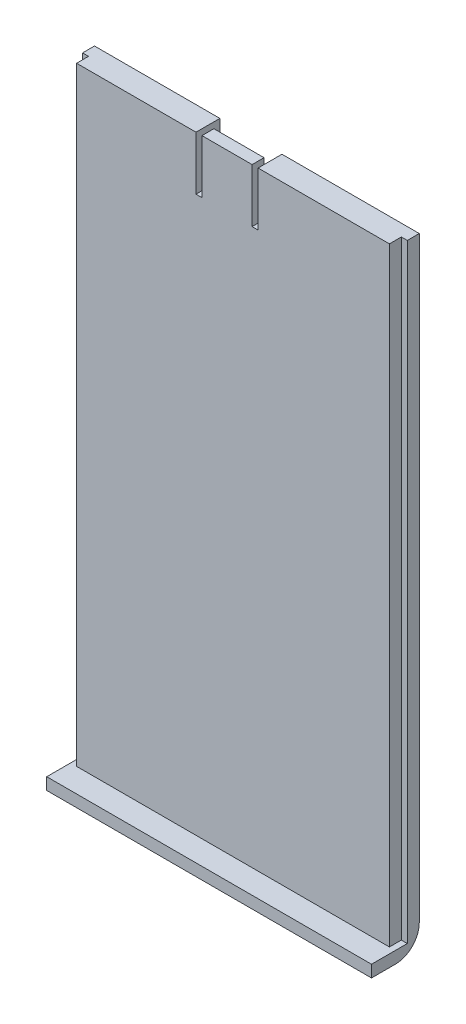
ISO-10303-21;
HEADER;
FILE_DESCRIPTION(('STEP AP214'),'2;1');
FILE_NAME('part.step','',(''),(''),'','','');
FILE_SCHEMA(('AUTOMOTIVE_DESIGN { 1 0 10303 214 1 1 1 1 }'));
ENDSEC;
DATA;
#1=APPLICATION_CONTEXT('core data for automotive mechanical design processes');
#2=APPLICATION_PROTOCOL_DEFINITION('international standard','automotive_design',2000,#1);
#3=PRODUCT_CONTEXT('',#1,'mechanical');
#4=PRODUCT('Part','Part','',(#3));
#5=PRODUCT_RELATED_PRODUCT_CATEGORY('part','',(#4));
#6=PRODUCT_DEFINITION_FORMATION('','',#4);
#7=PRODUCT_DEFINITION_CONTEXT('part definition',#1,'design');
#8=PRODUCT_DEFINITION('design','',#6,#7);
#9=PRODUCT_DEFINITION_SHAPE('','',#8);
#10=(LENGTH_UNIT() NAMED_UNIT(*) SI_UNIT(.MILLI.,.METRE.));
#11=(NAMED_UNIT(*) PLANE_ANGLE_UNIT() SI_UNIT($,.RADIAN.));
#12=(NAMED_UNIT(*) SI_UNIT($,.STERADIAN.) SOLID_ANGLE_UNIT());
#13=UNCERTAINTY_MEASURE_WITH_UNIT(LENGTH_MEASURE(1.E-05),#10,'distance_accuracy_value','');
#14=(GEOMETRIC_REPRESENTATION_CONTEXT(3) GLOBAL_UNCERTAINTY_ASSIGNED_CONTEXT((#13)) GLOBAL_UNIT_ASSIGNED_CONTEXT((#10,
#11,#12)) REPRESENTATION_CONTEXT('',''));
#15=CARTESIAN_POINT('',(0.,0.,0.));
#16=DIRECTION('',(0.,0.,1.));
#17=DIRECTION('',(1.,0.,0.));
#18=AXIS2_PLACEMENT_3D('',#15,#16,#17);
#19=CARTESIAN_POINT('',(0.,0.,0.));
#20=DIRECTION('',(0.,0.,-0.999999999999996));
#21=DIRECTION('',(-1.,0.,0.));
#22=AXIS2_PLACEMENT_3D('',#19,#20,#21);
#23=PLANE('',#22);
#24=DIRECTION('',(0.,1.,0.));
#25=VECTOR('',#24,1.);
#26=CARTESIAN_POINT('',(27.2,0.,-4.9960036108132E-13));
#27=LINE('',#26,#25);
#28=CARTESIAN_POINT('',(27.2,2.,-4.99600859388799E-13));
#29=VERTEX_POINT('',#28);
#30=CARTESIAN_POINT('',(27.2,52.,-4.9960036108132E-13));
#31=VERTEX_POINT('',#30);
#32=EDGE_CURVE('E297',#29,#31,#27,.T.);
#33=ORIENTED_EDGE('',*,*,#32,.F.);
#34=DIRECTION('',(1.,0.,0.));
#35=VECTOR('',#34,1.);
#36=CARTESIAN_POINT('',(0.,2.,0.));
#37=LINE('',#36,#35);
#38=CARTESIAN_POINT('',(0.,2.,0.));
#39=VERTEX_POINT('',#38);
#40=EDGE_CURVE('E46',#29,#39,#37,.F.);
#41=ORIENTED_EDGE('',*,*,#40,.T.);
#42=DIRECTION('',(0.,-1.,0.));
#43=VECTOR('',#42,1.);
#44=CARTESIAN_POINT('',(0.,0.,0.));
#45=LINE('',#44,#43);
#46=CARTESIAN_POINT('',(1.2490009027033E-13,52.,0.));
#47=VERTEX_POINT('',#46);
#48=EDGE_CURVE('E289',#47,#39,#45,.T.);
#49=ORIENTED_EDGE('',*,*,#48,.F.);
#50=DIRECTION('',(-1.,0.,0.));
#51=VECTOR('',#50,1.);
#52=CARTESIAN_POINT('',(1.2490009027033E-13,52.,0.));
#53=LINE('',#52,#51);
#54=CARTESIAN_POINT('',(10.5,52.,0.));
#55=VERTEX_POINT('',#54);
#56=EDGE_CURVE('E299',#55,#47,#53,.T.);
#57=ORIENTED_EDGE('',*,*,#56,.F.);
#58=DIRECTION('',(0.,1.,0.));
#59=VECTOR('',#58,1.);
#60=CARTESIAN_POINT('',(10.5,47.5,0.));
#61=LINE('',#60,#59);
#62=CARTESIAN_POINT('',(10.5,47.5,0.));
#63=VERTEX_POINT('',#62);
#64=EDGE_CURVE('E258',#63,#55,#61,.T.);
#65=ORIENTED_EDGE('',*,*,#64,.F.);
#66=DIRECTION('',(-1.,0.,0.));
#67=VECTOR('',#66,1.);
#68=CARTESIAN_POINT('',(10.5,47.5,0.));
#69=LINE('',#68,#67);
#70=CARTESIAN_POINT('',(15.7,47.5,0.));
#71=VERTEX_POINT('',#70);
#72=EDGE_CURVE('E251',#71,#63,#69,.T.);
#73=ORIENTED_EDGE('',*,*,#72,.F.);
#74=DIRECTION('',(0.,1.,0.));
#75=VECTOR('',#74,1.);
#76=CARTESIAN_POINT('',(15.7,47.5,0.));
#77=LINE('',#76,#75);
#78=CARTESIAN_POINT('',(15.7,52.,-4.9960036108132E-13));
#79=VERTEX_POINT('',#78);
#80=EDGE_CURVE('E233',#71,#79,#77,.T.);
#81=ORIENTED_EDGE('',*,*,#80,.T.);
#82=EDGE_CURVE('E300',#31,#79,#53,.T.);
#83=ORIENTED_EDGE('',*,*,#82,.F.);
#84=EDGE_LOOP('',(#33,#41,#49,#57,#65,#73,#81,#83));
#85=FACE_BOUND('',#84,.T.);
#86=ADVANCED_FACE('F38',(#85),#23,.T.);
#87=CARTESIAN_POINT('',(1.2490009027033E-13,52.,2.));
#88=DIRECTION('',(0.,-1.,0.));
#89=DIRECTION('',(0.,0.,-0.999999999999996));
#90=AXIS2_PLACEMENT_3D('',#87,#88,#89);
#91=PLANE('',#90);
#92=DIRECTION('',(0.,0.,0.999999999999996));
#93=VECTOR('',#92,1.);
#94=CARTESIAN_POINT('',(15.2,52.,0.));
#95=LINE('',#94,#93);
#96=CARTESIAN_POINT('',(15.2,52.,0.999999999999973));
#97=VERTEX_POINT('',#96);
#98=CARTESIAN_POINT('',(15.2,52.,1.99999999999997));
#99=VERTEX_POINT('',#98);
#100=EDGE_CURVE('E219',#97,#99,#95,.T.);
#101=ORIENTED_EDGE('',*,*,#100,.F.);
#102=DIRECTION('',(1.,0.,0.));
#103=VECTOR('',#102,1.);
#104=CARTESIAN_POINT('',(11.,52.,1.));
#105=LINE('',#104,#103);
#106=CARTESIAN_POINT('',(11.,52.,1.));
#107=VERTEX_POINT('',#106);
#108=EDGE_CURVE('E211',#107,#97,#105,.T.);
#109=ORIENTED_EDGE('',*,*,#108,.F.);
#110=DIRECTION('',(0.,0.,-0.999999999999996));
#111=VECTOR('',#110,1.);
#112=CARTESIAN_POINT('',(11.,52.,0.));
#113=LINE('',#112,#111);
#114=CARTESIAN_POINT('',(11.,52.,2.));
#115=VERTEX_POINT('',#114);
#116=EDGE_CURVE('E245',#115,#107,#113,.T.);
#117=ORIENTED_EDGE('',*,*,#116,.F.);
#118=DIRECTION('',(-1.,0.,0.));
#119=VECTOR('',#118,1.);
#120=CARTESIAN_POINT('',(1.2490009027033E-13,52.,2.));
#121=LINE('',#120,#119);
#122=EDGE_CURVE('E294',#99,#115,#121,.T.);
#123=ORIENTED_EDGE('',*,*,#122,.F.);
#124=EDGE_LOOP('',(#101,#109,#117,#123));
#125=FACE_BOUND('',#124,.T.);
#126=ADVANCED_FACE('F352',(#125),#91,.F.);
#127=CARTESIAN_POINT('',(10.5,52.,2.));
#128=VERTEX_POINT('',#127);
#129=CARTESIAN_POINT('',(0.500000000000125,52.,2.));
#130=VERTEX_POINT('',#129);
#131=EDGE_CURVE('E295',#128,#130,#121,.T.);
#132=ORIENTED_EDGE('',*,*,#131,.F.);
#133=DIRECTION('',(0.,0.,0.999999999999996));
#134=VECTOR('',#133,1.);
#135=CARTESIAN_POINT('',(10.5,52.,0.));
#136=LINE('',#135,#134);
#137=EDGE_CURVE('E236',#55,#128,#136,.T.);
#138=ORIENTED_EDGE('',*,*,#137,.F.);
#139=ORIENTED_EDGE('',*,*,#56,.T.);
#140=DIRECTION('',(0.,0.,-0.999999999999996));
#141=VECTOR('',#140,1.);
#142=CARTESIAN_POINT('',(1.2490009027033E-13,52.,2.));
#143=LINE('',#142,#141);
#144=CARTESIAN_POINT('',(1.2490009027033E-13,52.,1.));
#145=VERTEX_POINT('',#144);
#146=EDGE_CURVE('E293',#145,#47,#143,.T.);
#147=ORIENTED_EDGE('',*,*,#146,.F.);
#148=DIRECTION('',(-1.,0.,0.));
#149=VECTOR('',#148,1.);
#150=CARTESIAN_POINT('',(1.2490009027033E-13,52.,1.));
#151=LINE('',#150,#149);
#152=CARTESIAN_POINT('',(0.500000000000125,52.,1.));
#153=VERTEX_POINT('',#152);
#154=EDGE_CURVE('E283',#153,#145,#151,.T.);
#155=ORIENTED_EDGE('',*,*,#154,.F.);
#156=DIRECTION('',(0.,0.,0.999999999999996));
#157=VECTOR('',#156,1.);
#158=CARTESIAN_POINT('',(0.500000000000125,52.,1.));
#159=LINE('',#158,#157);
#160=EDGE_CURVE('E285',#153,#130,#159,.T.);
#161=ORIENTED_EDGE('',*,*,#160,.T.);
#162=EDGE_LOOP('',(#132,#138,#139,#147,#155,#161));
#163=FACE_BOUND('',#162,.T.);
#164=ADVANCED_FACE('F357',(#163),#91,.F.);
#165=CARTESIAN_POINT('',(27.2,0.,1.9999999999995));
#166=DIRECTION('',(-1.,0.,0.));
#167=DIRECTION('',(0.,0.,0.999999999999996));
#168=AXIS2_PLACEMENT_3D('',#165,#166,#167);
#169=PLANE('',#168);
#170=DIRECTION('',(0.,0.,-0.999999999999996));
#171=VECTOR('',#170,1.);
#172=CARTESIAN_POINT('',(27.2,0.,1.9999999999995));
#173=LINE('',#172,#171);
#174=CARTESIAN_POINT('',(27.2,0.,3.9999999999995));
#175=VERTEX_POINT('',#174);
#176=CARTESIAN_POINT('',(27.2,0.,2.));
#177=VERTEX_POINT('',#176);
#178=EDGE_CURVE('E168',#175,#177,#173,.T.);
#179=ORIENTED_EDGE('',*,*,#178,.T.);
#180=CARTESIAN_POINT('',(27.2,2.,2.));
#181=DIRECTION('',(-1.,0.,0.));
#182=DIRECTION('',(0.,0.,1.));
#183=AXIS2_PLACEMENT_3D('',#180,#181,#182);
#184=CIRCLE('',#183,2.);
#185=EDGE_CURVE('E60',#177,#29,#184,.F.);
#186=ORIENTED_EDGE('',*,*,#185,.T.);
#187=ORIENTED_EDGE('',*,*,#32,.T.);
#188=DIRECTION('',(0.,0.,-0.999999999999996));
#189=VECTOR('',#188,1.);
#190=CARTESIAN_POINT('',(27.2,52.,1.9999999999995));
#191=LINE('',#190,#189);
#192=CARTESIAN_POINT('',(27.2,52.,0.999999999999501));
#193=VERTEX_POINT('',#192);
#194=EDGE_CURVE('E177',#193,#31,#191,.T.);
#195=ORIENTED_EDGE('',*,*,#194,.F.);
#196=DIRECTION('',(0.,1.,0.));
#197=VECTOR('',#196,1.);
#198=CARTESIAN_POINT('',(27.2,0.,0.999999999999501));
#199=LINE('',#198,#197);
#200=CARTESIAN_POINT('',(27.2,1.,1.));
#201=VERTEX_POINT('',#200);
#202=EDGE_CURVE('E266',#201,#193,#199,.T.);
#203=ORIENTED_EDGE('',*,*,#202,.F.);
#204=DIRECTION('',(0.,0.,-0.999999999999996));
#205=VECTOR('',#204,1.);
#206=CARTESIAN_POINT('',(27.2,1.,4.));
#207=LINE('',#206,#205);
#208=CARTESIAN_POINT('',(27.2,1.,4.));
#209=VERTEX_POINT('',#208);
#210=EDGE_CURVE('E192',#209,#201,#207,.T.);
#211=ORIENTED_EDGE('',*,*,#210,.F.);
#212=DIRECTION('',(0.,-1.,0.));
#213=VECTOR('',#212,1.);
#214=CARTESIAN_POINT('',(27.2,0.,3.9999999999995));
#215=LINE('',#214,#213);
#216=EDGE_CURVE('E184',#209,#175,#215,.T.);
#217=ORIENTED_EDGE('',*,*,#216,.T.);
#218=EDGE_LOOP('',(#179,#186,#187,#195,#203,#211,#217));
#219=FACE_BOUND('',#218,.T.);
#220=ADVANCED_FACE('F189',(#219),#169,.F.);
#221=CARTESIAN_POINT('',(0.,0.,2.));
#222=DIRECTION('',(1.,0.,0.));
#223=DIRECTION('',(0.,0.,-0.999999999999996));
#224=AXIS2_PLACEMENT_3D('',#221,#222,#223);
#225=PLANE('',#224);
#226=ORIENTED_EDGE('',*,*,#48,.T.);
#227=CARTESIAN_POINT('',(0.,2.,2.));
#228=DIRECTION('',(1.,0.,0.));
#229=DIRECTION('',(0.,0.,-1.));
#230=AXIS2_PLACEMENT_3D('',#227,#228,#229);
#231=CIRCLE('',#230,2.);
#232=CARTESIAN_POINT('',(0.,0.,2.));
#233=VERTEX_POINT('',#232);
#234=EDGE_CURVE('E11',#39,#233,#231,.F.);
#235=ORIENTED_EDGE('',*,*,#234,.T.);
#236=DIRECTION('',(0.,0.,-0.999999999999996));
#237=VECTOR('',#236,1.);
#238=CARTESIAN_POINT('',(0.,0.,2.));
#239=LINE('',#238,#237);
#240=CARTESIAN_POINT('',(0.,0.,4.));
#241=VERTEX_POINT('',#240);
#242=EDGE_CURVE('E176',#241,#233,#239,.T.);
#243=ORIENTED_EDGE('',*,*,#242,.F.);
#244=DIRECTION('',(0.,1.,0.));
#245=VECTOR('',#244,1.);
#246=CARTESIAN_POINT('',(0.,0.,4.));
#247=LINE('',#246,#245);
#248=CARTESIAN_POINT('',(1.2490009027033E-13,1.,3.9999999999995));
#249=VERTEX_POINT('',#248);
#250=EDGE_CURVE('E187',#241,#249,#247,.T.);
#251=ORIENTED_EDGE('',*,*,#250,.T.);
#252=DIRECTION('',(0.,0.,-0.999999999999996));
#253=VECTOR('',#252,1.);
#254=CARTESIAN_POINT('',(1.2490009027033E-13,1.,3.9999999999995));
#255=LINE('',#254,#253);
#256=CARTESIAN_POINT('',(1.2490009027033E-13,1.,0.999999999999501));
#257=VERTEX_POINT('',#256);
#258=EDGE_CURVE('E198',#249,#257,#255,.T.);
#259=ORIENTED_EDGE('',*,*,#258,.T.);
#260=DIRECTION('',(0.,-1.,0.));
#261=VECTOR('',#260,1.);
#262=CARTESIAN_POINT('',(1.2490009027033E-13,52.,1.));
#263=LINE('',#262,#261);
#264=EDGE_CURVE('E279',#145,#257,#263,.T.);
#265=ORIENTED_EDGE('',*,*,#264,.F.);
#266=ORIENTED_EDGE('',*,*,#146,.T.);
#267=EDGE_LOOP('',(#226,#235,#243,#251,#259,#265,#266));
#268=FACE_BOUND('',#267,.T.);
#269=ADVANCED_FACE('F366',(#268),#225,.F.);
#270=CARTESIAN_POINT('',(0.,0.,2.));
#271=DIRECTION('',(0.,1.,0.));
#272=DIRECTION('',(0.,0.,0.999999999999996));
#273=AXIS2_PLACEMENT_3D('',#270,#271,#272);
#274=PLANE('',#273);
#275=ORIENTED_EDGE('',*,*,#242,.T.);
#276=DIRECTION('',(1.,0.,0.));
#277=VECTOR('',#276,1.);
#278=CARTESIAN_POINT('',(27.2,0.,2.));
#279=LINE('',#278,#277);
#280=EDGE_CURVE('E174',#233,#177,#279,.T.);
#281=ORIENTED_EDGE('',*,*,#280,.T.);
#282=ORIENTED_EDGE('',*,*,#178,.F.);
#283=DIRECTION('',(-1.,0.,0.));
#284=VECTOR('',#283,1.);
#285=CARTESIAN_POINT('',(27.2,0.,3.9999999999995));
#286=LINE('',#285,#284);
#287=EDGE_CURVE('E172',#175,#241,#286,.T.);
#288=ORIENTED_EDGE('',*,*,#287,.T.);
#289=EDGE_LOOP('',(#275,#281,#282,#288));
#290=FACE_BOUND('',#289,.T.);
#291=ADVANCED_FACE('F171',(#290),#274,.F.);
#292=ORIENTED_EDGE('',*,*,#82,.T.);
#293=DIRECTION('',(0.,0.,-0.999999999999996));
#294=VECTOR('',#293,1.);
#295=CARTESIAN_POINT('',(15.7,52.,-4.9960036108132E-13));
#296=LINE('',#295,#294);
#297=CARTESIAN_POINT('',(15.7,52.,1.9999999999995));
#298=VERTEX_POINT('',#297);
#299=EDGE_CURVE('E224',#298,#79,#296,.T.);
#300=ORIENTED_EDGE('',*,*,#299,.F.);
#301=CARTESIAN_POINT('',(26.7,52.,2.));
#302=VERTEX_POINT('',#301);
#303=EDGE_CURVE('E290',#302,#298,#121,.T.);
#304=ORIENTED_EDGE('',*,*,#303,.F.);
#305=DIRECTION('',(0.,0.,0.999999999999996));
#306=VECTOR('',#305,1.);
#307=CARTESIAN_POINT('',(26.7,52.,1.));
#308=LINE('',#307,#306);
#309=CARTESIAN_POINT('',(26.7,52.,1.));
#310=VERTEX_POINT('',#309);
#311=EDGE_CURVE('E274',#310,#302,#308,.T.);
#312=ORIENTED_EDGE('',*,*,#311,.F.);
#313=DIRECTION('',(-1.,0.,0.));
#314=VECTOR('',#313,1.);
#315=CARTESIAN_POINT('',(27.2,52.,0.999999999999501));
#316=LINE('',#315,#314);
#317=EDGE_CURVE('E268',#193,#310,#316,.T.);
#318=ORIENTED_EDGE('',*,*,#317,.F.);
#319=ORIENTED_EDGE('',*,*,#194,.T.);
#320=EDGE_LOOP('',(#292,#300,#304,#312,#318,#319));
#321=FACE_BOUND('',#320,.T.);
#322=ADVANCED_FACE('F323',(#321),#91,.F.);
#323=CARTESIAN_POINT('',(0.,0.,2.));
#324=DIRECTION('',(0.,0.,-0.999999999999996));
#325=DIRECTION('',(-1.,0.,0.));
#326=AXIS2_PLACEMENT_3D('',#323,#324,#325);
#327=PLANE('',#326);
#328=DIRECTION('',(0.,1.,0.));
#329=VECTOR('',#328,1.);
#330=CARTESIAN_POINT('',(0.500000000000125,52.,2.));
#331=LINE('',#330,#329);
#332=CARTESIAN_POINT('',(0.500000000000125,1.,1.9999999999995));
#333=VERTEX_POINT('',#332);
#334=EDGE_CURVE('E278',#333,#130,#331,.T.);
#335=ORIENTED_EDGE('',*,*,#334,.F.);
#336=DIRECTION('',(1.,0.,0.));
#337=VECTOR('',#336,1.);
#338=CARTESIAN_POINT('',(1.2490009027033E-13,1.,1.9999999999995));
#339=LINE('',#338,#337);
#340=CARTESIAN_POINT('',(26.7,0.999999999999876,2.));
#341=VERTEX_POINT('',#340);
#342=EDGE_CURVE('E204',#333,#341,#339,.T.);
#343=ORIENTED_EDGE('',*,*,#342,.T.);
#344=DIRECTION('',(0.,-1.,0.));
#345=VECTOR('',#344,1.);
#346=CARTESIAN_POINT('',(26.7,-1.2490009027033E-13,1.99999999999997));
#347=LINE('',#346,#345);
#348=EDGE_CURVE('E260',#302,#341,#347,.T.);
#349=ORIENTED_EDGE('',*,*,#348,.F.);
#350=ORIENTED_EDGE('',*,*,#303,.T.);
#351=DIRECTION('',(0.,1.,0.));
#352=VECTOR('',#351,1.);
#353=CARTESIAN_POINT('',(15.7,47.5,2.));
#354=LINE('',#353,#352);
#355=CARTESIAN_POINT('',(15.7,47.5,2.));
#356=VERTEX_POINT('',#355);
#357=EDGE_CURVE('E237',#356,#298,#354,.T.);
#358=ORIENTED_EDGE('',*,*,#357,.F.);
#359=DIRECTION('',(1.,0.,0.));
#360=VECTOR('',#359,1.);
#361=CARTESIAN_POINT('',(15.2,47.5,1.9999999999995));
#362=LINE('',#361,#360);
#363=CARTESIAN_POINT('',(15.2,47.5,1.9999999999995));
#364=VERTEX_POINT('',#363);
#365=EDGE_CURVE('E223',#364,#356,#362,.T.);
#366=ORIENTED_EDGE('',*,*,#365,.F.);
#367=DIRECTION('',(0.,1.,0.));
#368=VECTOR('',#367,1.);
#369=CARTESIAN_POINT('',(15.2,47.5,1.9999999999995));
#370=LINE('',#369,#368);
#371=EDGE_CURVE('E230',#364,#99,#370,.T.);
#372=ORIENTED_EDGE('',*,*,#371,.T.);
#373=ORIENTED_EDGE('',*,*,#122,.T.);
#374=DIRECTION('',(0.,1.,0.));
#375=VECTOR('',#374,1.);
#376=CARTESIAN_POINT('',(11.,47.5,1.9999999999995));
#377=LINE('',#376,#375);
#378=CARTESIAN_POINT('',(11.,47.5,1.9999999999995));
#379=VERTEX_POINT('',#378);
#380=EDGE_CURVE('E261',#379,#115,#377,.T.);
#381=ORIENTED_EDGE('',*,*,#380,.F.);
#382=DIRECTION('',(1.,0.,0.));
#383=VECTOR('',#382,1.);
#384=CARTESIAN_POINT('',(10.5,47.5,2.));
#385=LINE('',#384,#383);
#386=CARTESIAN_POINT('',(10.5,47.5,2.));
#387=VERTEX_POINT('',#386);
#388=EDGE_CURVE('E244',#387,#379,#385,.T.);
#389=ORIENTED_EDGE('',*,*,#388,.F.);
#390=DIRECTION('',(0.,1.,0.));
#391=VECTOR('',#390,1.);
#392=CARTESIAN_POINT('',(10.5,47.5,2.));
#393=LINE('',#392,#391);
#394=EDGE_CURVE('E254',#387,#128,#393,.T.);
#395=ORIENTED_EDGE('',*,*,#394,.T.);
#396=ORIENTED_EDGE('',*,*,#131,.T.);
#397=EDGE_LOOP('',(#335,#343,#349,#350,#358,#366,#372,#373,#381,#389,#395,#396));
#398=FACE_BOUND('',#397,.T.);
#399=ADVANCED_FACE('F335',(#398),#327,.F.);
#400=CARTESIAN_POINT('',(0.500000000000125,52.,1.));
#401=DIRECTION('',(1.,0.,0.));
#402=DIRECTION('',(0.,1.,0.));
#403=AXIS2_PLACEMENT_3D('',#400,#401,#402);
#404=PLANE('',#403);
#405=DIRECTION('',(0.,1.,0.));
#406=VECTOR('',#405,1.);
#407=CARTESIAN_POINT('',(0.500000000000125,52.,1.));
#408=LINE('',#407,#406);
#409=CARTESIAN_POINT('',(0.500000000000125,1.,0.999999999999501));
#410=VERTEX_POINT('',#409);
#411=EDGE_CURVE('E281',#410,#153,#408,.T.);
#412=ORIENTED_EDGE('',*,*,#411,.F.);
#413=DIRECTION('',(0.,0.,0.999999999999996));
#414=VECTOR('',#413,1.);
#415=CARTESIAN_POINT('',(0.500000000000125,1.,0.999999999999501));
#416=LINE('',#415,#414);
#417=EDGE_CURVE('E206',#410,#333,#416,.T.);
#418=ORIENTED_EDGE('',*,*,#417,.T.);
#419=ORIENTED_EDGE('',*,*,#334,.T.);
#420=ORIENTED_EDGE('',*,*,#160,.F.);
#421=EDGE_LOOP('',(#412,#418,#419,#420));
#422=FACE_BOUND('',#421,.T.);
#423=ADVANCED_FACE('F348',(#422),#404,.F.);
#424=CARTESIAN_POINT('',(0.,0.,1.));
#425=DIRECTION('',(0.,0.,0.999999999999996));
#426=DIRECTION('',(1.,0.,0.));
#427=AXIS2_PLACEMENT_3D('',#424,#425,#426);
#428=PLANE('',#427);
#429=DIRECTION('',(-1.,0.,0.));
#430=VECTOR('',#429,1.);
#431=CARTESIAN_POINT('',(1.2490009027033E-13,1.,0.999999999999501));
#432=LINE('',#431,#430);
#433=EDGE_CURVE('E208',#410,#257,#432,.T.);
#434=ORIENTED_EDGE('',*,*,#433,.F.);
#435=ORIENTED_EDGE('',*,*,#411,.T.);
#436=ORIENTED_EDGE('',*,*,#154,.T.);
#437=ORIENTED_EDGE('',*,*,#264,.T.);
#438=EDGE_LOOP('',(#434,#435,#436,#437));
#439=FACE_BOUND('',#438,.T.);
#440=ADVANCED_FACE('F340',(#439),#428,.T.);
#441=CARTESIAN_POINT('',(26.7,-1.2490009027033E-13,1.));
#442=DIRECTION('',(-1.,0.,0.));
#443=DIRECTION('',(0.,0.,0.999999999999996));
#444=AXIS2_PLACEMENT_3D('',#441,#442,#443);
#445=PLANE('',#444);
#446=ORIENTED_EDGE('',*,*,#348,.T.);
#447=DIRECTION('',(0.,0.,-0.999999999999996));
#448=VECTOR('',#447,1.);
#449=CARTESIAN_POINT('',(26.7,0.999999999999876,1.));
#450=LINE('',#449,#448);
#451=CARTESIAN_POINT('',(26.7,0.999999999999876,1.));
#452=VERTEX_POINT('',#451);
#453=EDGE_CURVE('E200',#341,#452,#450,.T.);
#454=ORIENTED_EDGE('',*,*,#453,.T.);
#455=DIRECTION('',(0.,-1.,0.));
#456=VECTOR('',#455,1.);
#457=CARTESIAN_POINT('',(26.7,-1.2490009027033E-13,1.));
#458=LINE('',#457,#456);
#459=EDGE_CURVE('E271',#310,#452,#458,.T.);
#460=ORIENTED_EDGE('',*,*,#459,.F.);
#461=ORIENTED_EDGE('',*,*,#311,.T.);
#462=EDGE_LOOP('',(#446,#454,#460,#461));
#463=FACE_BOUND('',#462,.T.);
#464=ADVANCED_FACE('F338',(#463),#445,.F.);
#465=CARTESIAN_POINT('',(0.,0.,1.));
#466=DIRECTION('',(0.,0.,0.999999999999996));
#467=DIRECTION('',(1.,0.,0.));
#468=AXIS2_PLACEMENT_3D('',#465,#466,#467);
#469=PLANE('',#468);
#470=DIRECTION('',(-1.,0.,0.));
#471=VECTOR('',#470,1.);
#472=CARTESIAN_POINT('',(1.2490009027033E-13,1.,0.999999999999501));
#473=LINE('',#472,#471);
#474=EDGE_CURVE('E308',#201,#452,#473,.T.);
#475=ORIENTED_EDGE('',*,*,#474,.F.);
#476=ORIENTED_EDGE('',*,*,#202,.T.);
#477=ORIENTED_EDGE('',*,*,#317,.T.);
#478=ORIENTED_EDGE('',*,*,#459,.T.);
#479=EDGE_LOOP('',(#475,#476,#477,#478));
#480=FACE_BOUND('',#479,.T.);
#481=ADVANCED_FACE('F318',(#480),#469,.T.);
#482=CARTESIAN_POINT('',(10.5,47.5,0.));
#483=DIRECTION('',(-1.,0.,0.));
#484=DIRECTION('',(0.,0.,0.999999999999996));
#485=AXIS2_PLACEMENT_3D('',#482,#483,#484);
#486=PLANE('',#485);
#487=ORIENTED_EDGE('',*,*,#137,.T.);
#488=ORIENTED_EDGE('',*,*,#394,.F.);
#489=DIRECTION('',(0.,0.,0.999999999999996));
#490=VECTOR('',#489,1.);
#491=CARTESIAN_POINT('',(10.5,47.5,0.));
#492=LINE('',#491,#490);
#493=EDGE_CURVE('E241',#63,#387,#492,.T.);
#494=ORIENTED_EDGE('',*,*,#493,.F.);
#495=ORIENTED_EDGE('',*,*,#64,.T.);
#496=EDGE_LOOP('',(#487,#488,#494,#495));
#497=FACE_BOUND('',#496,.T.);
#498=ADVANCED_FACE('F346',(#497),#486,.F.);
#499=CARTESIAN_POINT('',(11.,47.5,-4.9960036108132E-13));
#500=DIRECTION('',(1.,0.,0.));
#501=DIRECTION('',(0.,0.,-0.999999999999996));
#502=AXIS2_PLACEMENT_3D('',#499,#500,#501);
#503=PLANE('',#502);
#504=ORIENTED_EDGE('',*,*,#116,.T.);
#505=DIRECTION('',(0.,1.,0.));
#506=VECTOR('',#505,1.);
#507=CARTESIAN_POINT('',(11.,47.5,0.999999999999501));
#508=LINE('',#507,#506);
#509=CARTESIAN_POINT('',(11.,47.5,0.999999999999501));
#510=VERTEX_POINT('',#509);
#511=EDGE_CURVE('E214',#510,#107,#508,.T.);
#512=ORIENTED_EDGE('',*,*,#511,.F.);
#513=DIRECTION('',(0.,0.,-0.999999999999996));
#514=VECTOR('',#513,1.);
#515=CARTESIAN_POINT('',(11.,47.5,-4.9960036108132E-13));
#516=LINE('',#515,#514);
#517=EDGE_CURVE('E248',#379,#510,#516,.T.);
#518=ORIENTED_EDGE('',*,*,#517,.F.);
#519=ORIENTED_EDGE('',*,*,#380,.T.);
#520=EDGE_LOOP('',(#504,#512,#518,#519));
#521=FACE_BOUND('',#520,.T.);
#522=ADVANCED_FACE('F400',(#521),#503,.F.);
#523=CARTESIAN_POINT('',(0.,47.5,0.));
#524=DIRECTION('',(0.,1.,0.));
#525=DIRECTION('',(0.,0.,0.999999999999996));
#526=AXIS2_PLACEMENT_3D('',#523,#524,#525);
#527=PLANE('',#526);
#528=ORIENTED_EDGE('',*,*,#493,.T.);
#529=ORIENTED_EDGE('',*,*,#388,.T.);
#530=ORIENTED_EDGE('',*,*,#517,.T.);
#531=DIRECTION('',(1.,0.,0.));
#532=VECTOR('',#531,1.);
#533=CARTESIAN_POINT('',(11.,47.5,0.999999999999501));
#534=LINE('',#533,#532);
#535=CARTESIAN_POINT('',(15.2,47.5,0.999999999999501));
#536=VERTEX_POINT('',#535);
#537=EDGE_CURVE('E212',#510,#536,#534,.T.);
#538=ORIENTED_EDGE('',*,*,#537,.T.);
#539=DIRECTION('',(0.,0.,0.999999999999996));
#540=VECTOR('',#539,1.);
#541=CARTESIAN_POINT('',(15.2,47.5,-4.9960036108132E-13));
#542=LINE('',#541,#540);
#543=EDGE_CURVE('E221',#536,#364,#542,.T.);
#544=ORIENTED_EDGE('',*,*,#543,.T.);
#545=ORIENTED_EDGE('',*,*,#365,.T.);
#546=DIRECTION('',(0.,0.,-0.999999999999996));
#547=VECTOR('',#546,1.);
#548=CARTESIAN_POINT('',(15.7,47.5,0.));
#549=LINE('',#548,#547);
#550=EDGE_CURVE('E227',#356,#71,#549,.T.);
#551=ORIENTED_EDGE('',*,*,#550,.T.);
#552=ORIENTED_EDGE('',*,*,#72,.T.);
#553=EDGE_LOOP('',(#528,#529,#530,#538,#544,#545,#551,#552));
#554=FACE_BOUND('',#553,.T.);
#555=ADVANCED_FACE('F396',(#554),#527,.T.);
#556=CARTESIAN_POINT('',(15.2,47.5,-4.9960036108132E-13));
#557=DIRECTION('',(-1.,0.,0.));
#558=DIRECTION('',(0.,0.,0.999999999999996));
#559=AXIS2_PLACEMENT_3D('',#556,#557,#558);
#560=PLANE('',#559);
#561=ORIENTED_EDGE('',*,*,#543,.F.);
#562=DIRECTION('',(0.,1.,0.));
#563=VECTOR('',#562,1.);
#564=CARTESIAN_POINT('',(15.2,47.5,0.999999999999501));
#565=LINE('',#564,#563);
#566=EDGE_CURVE('E216',#536,#97,#565,.T.);
#567=ORIENTED_EDGE('',*,*,#566,.T.);
#568=ORIENTED_EDGE('',*,*,#100,.T.);
#569=ORIENTED_EDGE('',*,*,#371,.F.);
#570=EDGE_LOOP('',(#561,#567,#568,#569));
#571=FACE_BOUND('',#570,.T.);
#572=ADVANCED_FACE('F393',(#571),#560,.F.);
#573=CARTESIAN_POINT('',(15.7,47.5,0.));
#574=DIRECTION('',(1.,0.,0.));
#575=DIRECTION('',(0.,0.,-0.999999999999996));
#576=AXIS2_PLACEMENT_3D('',#573,#574,#575);
#577=PLANE('',#576);
#578=ORIENTED_EDGE('',*,*,#299,.T.);
#579=ORIENTED_EDGE('',*,*,#80,.F.);
#580=ORIENTED_EDGE('',*,*,#550,.F.);
#581=ORIENTED_EDGE('',*,*,#357,.T.);
#582=EDGE_LOOP('',(#578,#579,#580,#581));
#583=FACE_BOUND('',#582,.T.);
#584=ADVANCED_FACE('F329',(#583),#577,.F.);
#585=CARTESIAN_POINT('',(11.,47.5,0.999999999999501));
#586=DIRECTION('',(0.,0.,0.999999999999996));
#587=DIRECTION('',(1.,0.,0.));
#588=AXIS2_PLACEMENT_3D('',#585,#586,#587);
#589=PLANE('',#588);
#590=ORIENTED_EDGE('',*,*,#108,.T.);
#591=ORIENTED_EDGE('',*,*,#566,.F.);
#592=ORIENTED_EDGE('',*,*,#537,.F.);
#593=ORIENTED_EDGE('',*,*,#511,.T.);
#594=EDGE_LOOP('',(#590,#591,#592,#593));
#595=FACE_BOUND('',#594,.T.);
#596=ADVANCED_FACE('F385',(#595),#589,.F.);
#597=CARTESIAN_POINT('',(27.2,1.,4.));
#598=DIRECTION('',(0.,1.,0.));
#599=DIRECTION('',(0.,0.,0.999999999999996));
#600=AXIS2_PLACEMENT_3D('',#597,#598,#599);
#601=PLANE('',#600);
#602=ORIENTED_EDGE('',*,*,#417,.F.);
#603=ORIENTED_EDGE('',*,*,#433,.T.);
#604=ORIENTED_EDGE('',*,*,#258,.F.);
#605=DIRECTION('',(1.,0.,0.));
#606=VECTOR('',#605,1.);
#607=CARTESIAN_POINT('',(27.2,1.,4.));
#608=LINE('',#607,#606);
#609=EDGE_CURVE('E196',#249,#209,#608,.T.);
#610=ORIENTED_EDGE('',*,*,#609,.T.);
#611=ORIENTED_EDGE('',*,*,#210,.T.);
#612=ORIENTED_EDGE('',*,*,#474,.T.);
#613=ORIENTED_EDGE('',*,*,#453,.F.);
#614=ORIENTED_EDGE('',*,*,#342,.F.);
#615=EDGE_LOOP('',(#602,#603,#604,#610,#611,#612,#613,#614));
#616=FACE_BOUND('',#615,.T.);
#617=ADVANCED_FACE('F315',(#616),#601,.T.);
#618=CARTESIAN_POINT('',(0.,0.,4.));
#619=DIRECTION('',(0.,0.,0.999999999999996));
#620=DIRECTION('',(1.,0.,0.));
#621=AXIS2_PLACEMENT_3D('',#618,#619,#620);
#622=PLANE('',#621);
#623=ORIENTED_EDGE('',*,*,#216,.F.);
#624=ORIENTED_EDGE('',*,*,#609,.F.);
#625=ORIENTED_EDGE('',*,*,#250,.F.);
#626=ORIENTED_EDGE('',*,*,#287,.F.);
#627=EDGE_LOOP('',(#623,#624,#625,#626));
#628=FACE_BOUND('',#627,.T.);
#629=ADVANCED_FACE('F182',(#628),#622,.T.);
#630=CARTESIAN_POINT('',(0.,2.,2.));
#631=DIRECTION('',(-1.,0.,0.));
#632=DIRECTION('',(0.,0.,1.));
#633=AXIS2_PLACEMENT_3D('',#630,#631,#632);
#634=CYLINDRICAL_SURFACE('',#633,2.);
#635=ORIENTED_EDGE('',*,*,#234,.F.);
#636=ORIENTED_EDGE('',*,*,#40,.F.);
#637=ORIENTED_EDGE('',*,*,#185,.F.);
#638=ORIENTED_EDGE('',*,*,#280,.F.);
#639=EDGE_LOOP('',(#635,#636,#637,#638));
#640=FACE_BOUND('',#639,.T.);
#641=ADVANCED_FACE('F40',(#640),#634,.T.);
#642=CLOSED_SHELL('',(#86,#126,#164,#220,#269,#291,#322,#399,#423,#440,#464,#481,#498,#522,#555,
#572,#584,#596,#617,#629,#641));
#643=MANIFOLD_SOLID_BREP('B2',#642);
#644=ADVANCED_BREP_SHAPE_REPRESENTATION('',(#18,#643),#14);
#645=SHAPE_DEFINITION_REPRESENTATION(#9,#644);
ENDSEC;
END-ISO-10303-21;
